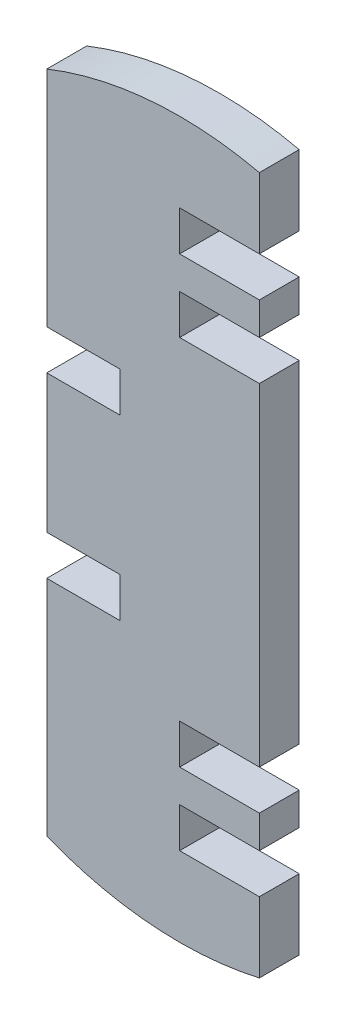
ISO-10303-21;
HEADER;
FILE_DESCRIPTION(('STEP AP214'),'2;1');
FILE_NAME('part.step','',(''),(''),'','','');
FILE_SCHEMA(('AUTOMOTIVE_DESIGN { 1 0 10303 214 1 1 1 1 }'));
ENDSEC;
DATA;
#1=APPLICATION_CONTEXT('core data for automotive mechanical design processes');
#2=APPLICATION_PROTOCOL_DEFINITION('international standard','automotive_design',2000,#1);
#3=PRODUCT_CONTEXT('',#1,'mechanical');
#4=PRODUCT('Part','Part','',(#3));
#5=PRODUCT_RELATED_PRODUCT_CATEGORY('part','',(#4));
#6=PRODUCT_DEFINITION_FORMATION('','',#4);
#7=PRODUCT_DEFINITION_CONTEXT('part definition',#1,'design');
#8=PRODUCT_DEFINITION('design','',#6,#7);
#9=PRODUCT_DEFINITION_SHAPE('','',#8);
#10=(LENGTH_UNIT() NAMED_UNIT(*) SI_UNIT(.MILLI.,.METRE.));
#11=(NAMED_UNIT(*) PLANE_ANGLE_UNIT() SI_UNIT($,.RADIAN.));
#12=(NAMED_UNIT(*) SI_UNIT($,.STERADIAN.) SOLID_ANGLE_UNIT());
#13=UNCERTAINTY_MEASURE_WITH_UNIT(LENGTH_MEASURE(1.E-05),#10,'distance_accuracy_value','');
#14=(GEOMETRIC_REPRESENTATION_CONTEXT(3) GLOBAL_UNCERTAINTY_ASSIGNED_CONTEXT((#13)) GLOBAL_UNIT_ASSIGNED_CONTEXT((#10,
#11,#12)) REPRESENTATION_CONTEXT('',''));
#15=CARTESIAN_POINT('',(0.,0.,0.));
#16=DIRECTION('',(0.,0.,1.));
#17=DIRECTION('',(1.,0.,0.));
#18=AXIS2_PLACEMENT_3D('',#15,#16,#17);
#19=CARTESIAN_POINT('',(683.467463005596,-95.0878027381918,3.));
#20=DIRECTION('',(0.,1.,0.));
#21=DIRECTION('',(0.,0.,1.));
#22=AXIS2_PLACEMENT_3D('',#19,#20,#21);
#23=PLANE('',#22);
#24=DIRECTION('',(1.,0.,0.));
#25=VECTOR('',#24,1.);
#26=CARTESIAN_POINT('',(683.467463005596,-95.0878027381918,0.));
#27=LINE('',#26,#25);
#28=CARTESIAN_POINT('',(677.938729313422,-95.0878027381918,0.));
#29=VERTEX_POINT('',#28);
#30=CARTESIAN_POINT('',(683.467463005596,-95.0878027381918,0.));
#31=VERTEX_POINT('',#30);
#32=EDGE_CURVE('E220',#29,#31,#27,.T.);
#33=ORIENTED_EDGE('',*,*,#32,.T.);
#34=DIRECTION('',(0.,0.,-1.));
#35=VECTOR('',#34,1.);
#36=CARTESIAN_POINT('',(683.467463005596,-95.0878027381918,3.));
#37=LINE('',#36,#35);
#38=CARTESIAN_POINT('',(683.467463005596,-95.0878027381918,3.));
#39=VERTEX_POINT('',#38);
#40=EDGE_CURVE('E11',#39,#31,#37,.T.);
#41=ORIENTED_EDGE('',*,*,#40,.F.);
#42=DIRECTION('',(1.,0.,0.));
#43=VECTOR('',#42,1.);
#44=CARTESIAN_POINT('',(683.467463005596,-95.0878027381918,3.));
#45=LINE('',#44,#43);
#46=CARTESIAN_POINT('',(677.938729313422,-95.0878027381918,3.));
#47=VERTEX_POINT('',#46);
#48=EDGE_CURVE('E287',#47,#39,#45,.T.);
#49=ORIENTED_EDGE('',*,*,#48,.F.);
#50=DIRECTION('',(0.,0.,-1.));
#51=VECTOR('',#50,1.);
#52=CARTESIAN_POINT('',(677.938729313422,-95.0878027381918,3.));
#53=LINE('',#52,#51);
#54=EDGE_CURVE('E233',#47,#29,#53,.T.);
#55=ORIENTED_EDGE('',*,*,#54,.T.);
#56=EDGE_LOOP('',(#33,#41,#49,#55));
#57=FACE_BOUND('',#56,.T.);
#58=ADVANCED_FACE('F32',(#57),#23,.F.);
#59=CARTESIAN_POINT('',(683.467463005596,-98.0878027381918,3.));
#60=DIRECTION('',(1.,0.,0.));
#61=DIRECTION('',(0.,0.,-1.));
#62=AXIS2_PLACEMENT_3D('',#59,#60,#61);
#63=PLANE('',#62);
#64=DIRECTION('',(0.,-1.,0.));
#65=VECTOR('',#64,1.);
#66=CARTESIAN_POINT('',(683.467463005596,-98.0878027381918,0.));
#67=LINE('',#66,#65);
#68=CARTESIAN_POINT('',(683.467463005596,-98.0878027381918,0.));
#69=VERTEX_POINT('',#68);
#70=EDGE_CURVE('E216',#31,#69,#67,.T.);
#71=ORIENTED_EDGE('',*,*,#70,.T.);
#72=DIRECTION('',(0.,0.,-1.));
#73=VECTOR('',#72,1.);
#74=CARTESIAN_POINT('',(683.467463005596,-98.0878027381918,3.));
#75=LINE('',#74,#73);
#76=CARTESIAN_POINT('',(683.467463005596,-98.0878027381918,3.));
#77=VERTEX_POINT('',#76);
#78=EDGE_CURVE('E39',#77,#69,#75,.T.);
#79=ORIENTED_EDGE('',*,*,#78,.F.);
#80=DIRECTION('',(0.,-1.,0.));
#81=VECTOR('',#80,1.);
#82=CARTESIAN_POINT('',(683.467463005596,-98.0878027381918,3.));
#83=LINE('',#82,#81);
#84=EDGE_CURVE('E229',#39,#77,#83,.T.);
#85=ORIENTED_EDGE('',*,*,#84,.F.);
#86=ORIENTED_EDGE('',*,*,#40,.T.);
#87=EDGE_LOOP('',(#71,#79,#85,#86));
#88=FACE_BOUND('',#87,.T.);
#89=ADVANCED_FACE('F228',(#88),#63,.F.);
#90=CARTESIAN_POINT('',(677.938729313422,-98.0878027381918,3.));
#91=DIRECTION('',(0.,-1.,0.));
#92=DIRECTION('',(0.,0.,-1.));
#93=AXIS2_PLACEMENT_3D('',#90,#91,#92);
#94=PLANE('',#93);
#95=DIRECTION('',(-1.,0.,0.));
#96=VECTOR('',#95,1.);
#97=CARTESIAN_POINT('',(677.938729313422,-98.0878027381918,0.));
#98=LINE('',#97,#96);
#99=CARTESIAN_POINT('',(677.938729313422,-98.0878027381918,0.));
#100=VERTEX_POINT('',#99);
#101=EDGE_CURVE('E222',#69,#100,#98,.T.);
#102=ORIENTED_EDGE('',*,*,#101,.T.);
#103=DIRECTION('',(0.,0.,-1.));
#104=VECTOR('',#103,1.);
#105=CARTESIAN_POINT('',(677.938729313422,-98.0878027381918,3.));
#106=LINE('',#105,#104);
#107=CARTESIAN_POINT('',(677.938729313422,-98.0878027381918,3.));
#108=VERTEX_POINT('',#107);
#109=EDGE_CURVE('E413',#108,#100,#106,.T.);
#110=ORIENTED_EDGE('',*,*,#109,.F.);
#111=DIRECTION('',(-1.,0.,0.));
#112=VECTOR('',#111,1.);
#113=CARTESIAN_POINT('',(677.938729313422,-98.0878027381918,3.));
#114=LINE('',#113,#112);
#115=EDGE_CURVE('E290',#77,#108,#114,.T.);
#116=ORIENTED_EDGE('',*,*,#115,.F.);
#117=ORIENTED_EDGE('',*,*,#78,.T.);
#118=EDGE_LOOP('',(#102,#110,#116,#117));
#119=FACE_BOUND('',#118,.T.);
#120=ADVANCED_FACE('F417',(#119),#94,.F.);
#121=CARTESIAN_POINT('',(677.938729313422,-98.0878027381918,3.));
#122=DIRECTION('',(1.,0.,0.));
#123=DIRECTION('',(0.,0.,-1.));
#124=AXIS2_PLACEMENT_3D('',#121,#122,#123);
#125=PLANE('',#124);
#126=DIRECTION('',(0.,-1.,0.));
#127=VECTOR('',#126,1.);
#128=CARTESIAN_POINT('',(677.938729313422,-98.0878027381918,0.));
#129=LINE('',#128,#127);
#130=CARTESIAN_POINT('',(677.938729313422,-108.479521793119,0.));
#131=VERTEX_POINT('',#130);
#132=EDGE_CURVE('E237',#100,#131,#129,.T.);
#133=ORIENTED_EDGE('',*,*,#132,.T.);
#134=DIRECTION('',(0.,0.,-1.));
#135=VECTOR('',#134,1.);
#136=CARTESIAN_POINT('',(677.938729313422,-108.479521793119,3.));
#137=LINE('',#136,#135);
#138=CARTESIAN_POINT('',(677.938729313422,-108.479521793119,3.));
#139=VERTEX_POINT('',#138);
#140=EDGE_CURVE('E410',#139,#131,#137,.T.);
#141=ORIENTED_EDGE('',*,*,#140,.F.);
#142=DIRECTION('',(0.,-1.,0.));
#143=VECTOR('',#142,1.);
#144=CARTESIAN_POINT('',(677.938729313422,-98.0878027381918,3.));
#145=LINE('',#144,#143);
#146=EDGE_CURVE('E292',#108,#139,#145,.T.);
#147=ORIENTED_EDGE('',*,*,#146,.F.);
#148=ORIENTED_EDGE('',*,*,#109,.T.);
#149=EDGE_LOOP('',(#133,#141,#147,#148));
#150=FACE_BOUND('',#149,.T.);
#151=ADVANCED_FACE('F425',(#150),#125,.F.);
#152=CARTESIAN_POINT('',(677.938729313422,-108.479521793119,3.));
#153=DIRECTION('',(0.,1.,0.));
#154=DIRECTION('',(0.,0.,1.));
#155=AXIS2_PLACEMENT_3D('',#152,#153,#154);
#156=PLANE('',#155);
#157=DIRECTION('',(1.,0.,0.));
#158=VECTOR('',#157,1.);
#159=CARTESIAN_POINT('',(677.938729313422,-108.479521793119,0.));
#160=LINE('',#159,#158);
#161=CARTESIAN_POINT('',(683.467463005596,-108.479521793119,0.));
#162=VERTEX_POINT('',#161);
#163=EDGE_CURVE('E239',#131,#162,#160,.T.);
#164=ORIENTED_EDGE('',*,*,#163,.T.);
#165=DIRECTION('',(0.,0.,-1.));
#166=VECTOR('',#165,1.);
#167=CARTESIAN_POINT('',(683.467463005596,-108.479521793119,3.));
#168=LINE('',#167,#166);
#169=CARTESIAN_POINT('',(683.467463005596,-108.479521793119,3.));
#170=VERTEX_POINT('',#169);
#171=EDGE_CURVE('E407',#170,#162,#168,.T.);
#172=ORIENTED_EDGE('',*,*,#171,.F.);
#173=DIRECTION('',(1.,0.,0.));
#174=VECTOR('',#173,1.);
#175=CARTESIAN_POINT('',(677.938729313422,-108.479521793119,3.));
#176=LINE('',#175,#174);
#177=EDGE_CURVE('E294',#139,#170,#176,.T.);
#178=ORIENTED_EDGE('',*,*,#177,.F.);
#179=ORIENTED_EDGE('',*,*,#140,.T.);
#180=EDGE_LOOP('',(#164,#172,#178,#179));
#181=FACE_BOUND('',#180,.T.);
#182=ADVANCED_FACE('F428',(#181),#156,.F.);
#183=CARTESIAN_POINT('',(683.467463005596,-108.479521793119,3.));
#184=DIRECTION('',(1.,0.,0.));
#185=DIRECTION('',(0.,0.,-1.));
#186=AXIS2_PLACEMENT_3D('',#183,#184,#185);
#187=PLANE('',#186);
#188=DIRECTION('',(0.,-1.,0.));
#189=VECTOR('',#188,1.);
#190=CARTESIAN_POINT('',(683.467463005596,-108.479521793119,0.));
#191=LINE('',#190,#189);
#192=CARTESIAN_POINT('',(683.467463005596,-111.479521793119,0.));
#193=VERTEX_POINT('',#192);
#194=EDGE_CURVE('E241',#162,#193,#191,.T.);
#195=ORIENTED_EDGE('',*,*,#194,.T.);
#196=DIRECTION('',(0.,0.,-1.));
#197=VECTOR('',#196,1.);
#198=CARTESIAN_POINT('',(683.467463005596,-111.479521793119,3.));
#199=LINE('',#198,#197);
#200=CARTESIAN_POINT('',(683.467463005596,-111.479521793119,3.));
#201=VERTEX_POINT('',#200);
#202=EDGE_CURVE('E404',#201,#193,#199,.T.);
#203=ORIENTED_EDGE('',*,*,#202,.F.);
#204=DIRECTION('',(0.,-1.,0.));
#205=VECTOR('',#204,1.);
#206=CARTESIAN_POINT('',(683.467463005596,-108.479521793119,3.));
#207=LINE('',#206,#205);
#208=EDGE_CURVE('E296',#170,#201,#207,.T.);
#209=ORIENTED_EDGE('',*,*,#208,.F.);
#210=ORIENTED_EDGE('',*,*,#171,.T.);
#211=EDGE_LOOP('',(#195,#203,#209,#210));
#212=FACE_BOUND('',#211,.T.);
#213=ADVANCED_FACE('F433',(#212),#187,.F.);
#214=CARTESIAN_POINT('',(683.467463005596,-111.479521793119,3.));
#215=DIRECTION('',(0.,-1.,0.));
#216=DIRECTION('',(0.,0.,-1.));
#217=AXIS2_PLACEMENT_3D('',#214,#215,#216);
#218=PLANE('',#217);
#219=DIRECTION('',(-1.,0.,0.));
#220=VECTOR('',#219,1.);
#221=CARTESIAN_POINT('',(683.467463005596,-111.479521793119,0.));
#222=LINE('',#221,#220);
#223=CARTESIAN_POINT('',(677.938729313422,-111.479521793119,0.));
#224=VERTEX_POINT('',#223);
#225=EDGE_CURVE('E243',#193,#224,#222,.T.);
#226=ORIENTED_EDGE('',*,*,#225,.T.);
#227=DIRECTION('',(0.,0.,-1.));
#228=VECTOR('',#227,1.);
#229=CARTESIAN_POINT('',(677.938729313422,-111.479521793119,3.));
#230=LINE('',#229,#228);
#231=CARTESIAN_POINT('',(677.938729313422,-111.479521793119,3.));
#232=VERTEX_POINT('',#231);
#233=EDGE_CURVE('E401',#232,#224,#230,.T.);
#234=ORIENTED_EDGE('',*,*,#233,.F.);
#235=DIRECTION('',(-1.,0.,0.));
#236=VECTOR('',#235,1.);
#237=CARTESIAN_POINT('',(683.467463005596,-111.479521793119,3.));
#238=LINE('',#237,#236);
#239=EDGE_CURVE('E298',#201,#232,#238,.T.);
#240=ORIENTED_EDGE('',*,*,#239,.F.);
#241=ORIENTED_EDGE('',*,*,#202,.T.);
#242=EDGE_LOOP('',(#226,#234,#240,#241));
#243=FACE_BOUND('',#242,.T.);
#244=ADVANCED_FACE('F439',(#243),#218,.F.);
#245=CARTESIAN_POINT('',(677.938729313422,-128.283662265656,3.));
#246=DIRECTION('',(1.,0.,0.));
#247=DIRECTION('',(0.,0.,-1.));
#248=AXIS2_PLACEMENT_3D('',#245,#246,#247);
#249=PLANE('',#248);
#250=DIRECTION('',(0.,-1.,0.));
#251=VECTOR('',#250,1.);
#252=CARTESIAN_POINT('',(677.938729313422,-128.283662265656,0.));
#253=LINE('',#252,#251);
#254=CARTESIAN_POINT('',(677.938729313422,-128.283662265656,0.));
#255=VERTEX_POINT('',#254);
#256=EDGE_CURVE('E245',#224,#255,#253,.T.);
#257=ORIENTED_EDGE('',*,*,#256,.T.);
#258=DIRECTION('',(0.,0.,-1.));
#259=VECTOR('',#258,1.);
#260=CARTESIAN_POINT('',(677.938729313422,-128.283662265656,3.));
#261=LINE('',#260,#259);
#262=CARTESIAN_POINT('',(677.938729313422,-128.283662265656,3.));
#263=VERTEX_POINT('',#262);
#264=EDGE_CURVE('E398',#263,#255,#261,.T.);
#265=ORIENTED_EDGE('',*,*,#264,.F.);
#266=DIRECTION('',(0.,-1.,0.));
#267=VECTOR('',#266,1.);
#268=CARTESIAN_POINT('',(677.938729313422,-128.283662265656,3.));
#269=LINE('',#268,#267);
#270=EDGE_CURVE('E300',#232,#263,#269,.T.);
#271=ORIENTED_EDGE('',*,*,#270,.F.);
#272=ORIENTED_EDGE('',*,*,#233,.T.);
#273=EDGE_LOOP('',(#257,#265,#271,#272));
#274=FACE_BOUND('',#273,.T.);
#275=ADVANCED_FACE('F443',(#274),#249,.F.);
#276=CARTESIAN_POINT('',(687.938729313422,-103.283662265656,3.));
#277=DIRECTION('',(0.,0.,-1.));
#278=DIRECTION('',(-1.,0.,0.));
#279=AXIS2_PLACEMENT_3D('',#276,#277,#278);
#280=CYLINDRICAL_SURFACE('',#279,26.9258240356725);
#281=CARTESIAN_POINT('',(687.938729313422,-103.283662265656,0.));
#282=DIRECTION('',(0.,0.,1.));
#283=DIRECTION('',(1.,0.,0.));
#284=AXIS2_PLACEMENT_3D('',#281,#282,#283);
#285=CIRCLE('',#284,26.9258240356725);
#286=CARTESIAN_POINT('',(693.938729313422,-129.532471762469,0.));
#287=VERTEX_POINT('',#286);
#288=EDGE_CURVE('E247',#255,#287,#285,.T.);
#289=ORIENTED_EDGE('',*,*,#288,.T.);
#290=DIRECTION('',(0.,0.,-1.));
#291=VECTOR('',#290,1.);
#292=CARTESIAN_POINT('',(693.938729313422,-129.532471762469,3.));
#293=LINE('',#292,#291);
#294=CARTESIAN_POINT('',(693.938729313422,-129.532471762469,3.));
#295=VERTEX_POINT('',#294);
#296=EDGE_CURVE('E395',#295,#287,#293,.T.);
#297=ORIENTED_EDGE('',*,*,#296,.F.);
#298=CARTESIAN_POINT('',(687.938729313422,-103.283662265656,3.));
#299=DIRECTION('',(0.,0.,1.));
#300=DIRECTION('',(1.,0.,0.));
#301=AXIS2_PLACEMENT_3D('',#298,#299,#300);
#302=CIRCLE('',#301,26.9258240356725);
#303=EDGE_CURVE('E302',#263,#295,#302,.T.);
#304=ORIENTED_EDGE('',*,*,#303,.F.);
#305=ORIENTED_EDGE('',*,*,#264,.T.);
#306=EDGE_LOOP('',(#289,#297,#304,#305));
#307=FACE_BOUND('',#306,.T.);
#308=ADVANCED_FACE('F448',(#307),#280,.T.);
#309=CARTESIAN_POINT('',(693.938729313422,-124.233634180954,3.));
#310=DIRECTION('',(-1.,0.,0.));
#311=DIRECTION('',(0.,0.,1.));
#312=AXIS2_PLACEMENT_3D('',#309,#310,#311);
#313=PLANE('',#312);
#314=DIRECTION('',(0.,1.,0.));
#315=VECTOR('',#314,1.);
#316=CARTESIAN_POINT('',(693.938729313422,-124.233634180954,0.));
#317=LINE('',#316,#315);
#318=CARTESIAN_POINT('',(693.938729313422,-124.233634180954,0.));
#319=VERTEX_POINT('',#318);
#320=EDGE_CURVE('E249',#287,#319,#317,.T.);
#321=ORIENTED_EDGE('',*,*,#320,.T.);
#322=DIRECTION('',(0.,0.,-1.));
#323=VECTOR('',#322,1.);
#324=CARTESIAN_POINT('',(693.938729313422,-124.233634180954,3.));
#325=LINE('',#324,#323);
#326=CARTESIAN_POINT('',(693.938729313422,-124.233634180954,3.));
#327=VERTEX_POINT('',#326);
#328=EDGE_CURVE('E392',#327,#319,#325,.T.);
#329=ORIENTED_EDGE('',*,*,#328,.F.);
#330=DIRECTION('',(0.,1.,0.));
#331=VECTOR('',#330,1.);
#332=CARTESIAN_POINT('',(693.938729313422,-124.233634180954,3.));
#333=LINE('',#332,#331);
#334=EDGE_CURVE('E304',#295,#327,#333,.T.);
#335=ORIENTED_EDGE('',*,*,#334,.F.);
#336=ORIENTED_EDGE('',*,*,#296,.T.);
#337=EDGE_LOOP('',(#321,#329,#335,#336));
#338=FACE_BOUND('',#337,.T.);
#339=ADVANCED_FACE('F454',(#338),#313,.F.);
#340=CARTESIAN_POINT('',(687.938729313422,-124.233634180954,3.));
#341=DIRECTION('',(0.,-1.,0.));
#342=DIRECTION('',(0.,0.,-1.));
#343=AXIS2_PLACEMENT_3D('',#340,#341,#342);
#344=PLANE('',#343);
#345=DIRECTION('',(-1.,0.,0.));
#346=VECTOR('',#345,1.);
#347=CARTESIAN_POINT('',(687.938729313422,-124.233634180954,0.));
#348=LINE('',#347,#346);
#349=CARTESIAN_POINT('',(687.938729313422,-124.233634180954,0.));
#350=VERTEX_POINT('',#349);
#351=EDGE_CURVE('E251',#319,#350,#348,.T.);
#352=ORIENTED_EDGE('',*,*,#351,.T.);
#353=DIRECTION('',(0.,0.,-1.));
#354=VECTOR('',#353,1.);
#355=CARTESIAN_POINT('',(687.938729313422,-124.233634180954,3.));
#356=LINE('',#355,#354);
#357=CARTESIAN_POINT('',(687.938729313422,-124.233634180954,3.));
#358=VERTEX_POINT('',#357);
#359=EDGE_CURVE('E389',#358,#350,#356,.T.);
#360=ORIENTED_EDGE('',*,*,#359,.F.);
#361=DIRECTION('',(-1.,0.,0.));
#362=VECTOR('',#361,1.);
#363=CARTESIAN_POINT('',(687.938729313422,-124.233634180954,3.));
#364=LINE('',#363,#362);
#365=EDGE_CURVE('E306',#327,#358,#364,.T.);
#366=ORIENTED_EDGE('',*,*,#365,.F.);
#367=ORIENTED_EDGE('',*,*,#328,.T.);
#368=EDGE_LOOP('',(#352,#360,#366,#367));
#369=FACE_BOUND('',#368,.T.);
#370=ADVANCED_FACE('F458',(#369),#344,.F.);
#371=CARTESIAN_POINT('',(687.938729313422,-121.233634180954,3.));
#372=DIRECTION('',(-1.,0.,0.));
#373=DIRECTION('',(0.,0.,1.));
#374=AXIS2_PLACEMENT_3D('',#371,#372,#373);
#375=PLANE('',#374);
#376=DIRECTION('',(0.,1.,0.));
#377=VECTOR('',#376,1.);
#378=CARTESIAN_POINT('',(687.938729313422,-121.233634180954,0.));
#379=LINE('',#378,#377);
#380=CARTESIAN_POINT('',(687.938729313422,-121.233634180954,0.));
#381=VERTEX_POINT('',#380);
#382=EDGE_CURVE('E253',#350,#381,#379,.T.);
#383=ORIENTED_EDGE('',*,*,#382,.T.);
#384=DIRECTION('',(0.,0.,-1.));
#385=VECTOR('',#384,1.);
#386=CARTESIAN_POINT('',(687.938729313422,-121.233634180954,3.));
#387=LINE('',#386,#385);
#388=CARTESIAN_POINT('',(687.938729313422,-121.233634180954,3.));
#389=VERTEX_POINT('',#388);
#390=EDGE_CURVE('E386',#389,#381,#387,.T.);
#391=ORIENTED_EDGE('',*,*,#390,.F.);
#392=DIRECTION('',(0.,1.,0.));
#393=VECTOR('',#392,1.);
#394=CARTESIAN_POINT('',(687.938729313422,-121.233634180954,3.));
#395=LINE('',#394,#393);
#396=EDGE_CURVE('E308',#358,#389,#395,.T.);
#397=ORIENTED_EDGE('',*,*,#396,.F.);
#398=ORIENTED_EDGE('',*,*,#359,.T.);
#399=EDGE_LOOP('',(#383,#391,#397,#398));
#400=FACE_BOUND('',#399,.T.);
#401=ADVANCED_FACE('F463',(#400),#375,.F.);
#402=CARTESIAN_POINT('',(687.938729313422,-121.233634180954,3.));
#403=DIRECTION('',(0.,1.,0.));
#404=DIRECTION('',(0.,0.,1.));
#405=AXIS2_PLACEMENT_3D('',#402,#403,#404);
#406=PLANE('',#405);
#407=DIRECTION('',(1.,0.,0.));
#408=VECTOR('',#407,1.);
#409=CARTESIAN_POINT('',(687.938729313422,-121.233634180954,0.));
#410=LINE('',#409,#408);
#411=CARTESIAN_POINT('',(693.938729313422,-121.233634180954,0.));
#412=VERTEX_POINT('',#411);
#413=EDGE_CURVE('E255',#381,#412,#410,.T.);
#414=ORIENTED_EDGE('',*,*,#413,.T.);
#415=DIRECTION('',(0.,0.,-1.));
#416=VECTOR('',#415,1.);
#417=CARTESIAN_POINT('',(693.938729313422,-121.233634180954,3.));
#418=LINE('',#417,#416);
#419=CARTESIAN_POINT('',(693.938729313422,-121.233634180954,3.));
#420=VERTEX_POINT('',#419);
#421=EDGE_CURVE('E383',#420,#412,#418,.T.);
#422=ORIENTED_EDGE('',*,*,#421,.F.);
#423=DIRECTION('',(1.,0.,0.));
#424=VECTOR('',#423,1.);
#425=CARTESIAN_POINT('',(687.938729313422,-121.233634180954,3.));
#426=LINE('',#425,#424);
#427=EDGE_CURVE('E310',#389,#420,#426,.T.);
#428=ORIENTED_EDGE('',*,*,#427,.F.);
#429=ORIENTED_EDGE('',*,*,#390,.T.);
#430=EDGE_LOOP('',(#414,#422,#428,#429));
#431=FACE_BOUND('',#430,.T.);
#432=ADVANCED_FACE('F469',(#431),#406,.F.);
#433=CARTESIAN_POINT('',(693.938729313422,-118.783662265656,3.));
#434=DIRECTION('',(-1.,0.,0.));
#435=DIRECTION('',(0.,0.,1.));
#436=AXIS2_PLACEMENT_3D('',#433,#434,#435);
#437=PLANE('',#436);
#438=DIRECTION('',(0.,1.,0.));
#439=VECTOR('',#438,1.);
#440=CARTESIAN_POINT('',(693.938729313422,-118.783662265656,0.));
#441=LINE('',#440,#439);
#442=CARTESIAN_POINT('',(693.938729313422,-118.783662265656,0.));
#443=VERTEX_POINT('',#442);
#444=EDGE_CURVE('E257',#412,#443,#441,.T.);
#445=ORIENTED_EDGE('',*,*,#444,.T.);
#446=DIRECTION('',(0.,0.,-1.));
#447=VECTOR('',#446,1.);
#448=CARTESIAN_POINT('',(693.938729313422,-118.783662265656,3.));
#449=LINE('',#448,#447);
#450=CARTESIAN_POINT('',(693.938729313422,-118.783662265656,3.));
#451=VERTEX_POINT('',#450);
#452=EDGE_CURVE('E380',#451,#443,#449,.T.);
#453=ORIENTED_EDGE('',*,*,#452,.F.);
#454=DIRECTION('',(0.,1.,0.));
#455=VECTOR('',#454,1.);
#456=CARTESIAN_POINT('',(693.938729313422,-118.783662265656,3.));
#457=LINE('',#456,#455);
#458=EDGE_CURVE('E312',#420,#451,#457,.T.);
#459=ORIENTED_EDGE('',*,*,#458,.F.);
#460=ORIENTED_EDGE('',*,*,#421,.T.);
#461=EDGE_LOOP('',(#445,#453,#459,#460));
#462=FACE_BOUND('',#461,.T.);
#463=ADVANCED_FACE('F473',(#462),#437,.F.);
#464=CARTESIAN_POINT('',(687.938729313422,-118.783662265656,3.));
#465=DIRECTION('',(0.,-1.,0.));
#466=DIRECTION('',(0.,0.,-1.));
#467=AXIS2_PLACEMENT_3D('',#464,#465,#466);
#468=PLANE('',#467);
#469=DIRECTION('',(-1.,0.,0.));
#470=VECTOR('',#469,1.);
#471=CARTESIAN_POINT('',(687.938729313422,-118.783662265656,0.));
#472=LINE('',#471,#470);
#473=CARTESIAN_POINT('',(687.938729313422,-118.783662265656,0.));
#474=VERTEX_POINT('',#473);
#475=EDGE_CURVE('E259',#443,#474,#472,.T.);
#476=ORIENTED_EDGE('',*,*,#475,.T.);
#477=DIRECTION('',(0.,0.,-1.));
#478=VECTOR('',#477,1.);
#479=CARTESIAN_POINT('',(687.938729313422,-118.783662265656,3.));
#480=LINE('',#479,#478);
#481=CARTESIAN_POINT('',(687.938729313422,-118.783662265656,3.));
#482=VERTEX_POINT('',#481);
#483=EDGE_CURVE('E377',#482,#474,#480,.T.);
#484=ORIENTED_EDGE('',*,*,#483,.F.);
#485=DIRECTION('',(-1.,0.,0.));
#486=VECTOR('',#485,1.);
#487=CARTESIAN_POINT('',(687.938729313422,-118.783662265656,3.));
#488=LINE('',#487,#486);
#489=EDGE_CURVE('E314',#451,#482,#488,.T.);
#490=ORIENTED_EDGE('',*,*,#489,.F.);
#491=ORIENTED_EDGE('',*,*,#452,.T.);
#492=EDGE_LOOP('',(#476,#484,#490,#491));
#493=FACE_BOUND('',#492,.T.);
#494=ADVANCED_FACE('F478',(#493),#468,.F.);
#495=CARTESIAN_POINT('',(687.938729313422,-118.783662265656,3.));
#496=DIRECTION('',(-1.,0.,0.));
#497=DIRECTION('',(0.,0.,1.));
#498=AXIS2_PLACEMENT_3D('',#495,#496,#497);
#499=PLANE('',#498);
#500=DIRECTION('',(0.,1.,0.));
#501=VECTOR('',#500,1.);
#502=CARTESIAN_POINT('',(687.938729313422,-118.783662265656,0.));
#503=LINE('',#502,#501);
#504=CARTESIAN_POINT('',(687.938729313422,-115.783662265656,0.));
#505=VERTEX_POINT('',#504);
#506=EDGE_CURVE('E261',#474,#505,#503,.T.);
#507=ORIENTED_EDGE('',*,*,#506,.T.);
#508=DIRECTION('',(0.,0.,-1.));
#509=VECTOR('',#508,1.);
#510=CARTESIAN_POINT('',(687.938729313422,-115.783662265656,3.));
#511=LINE('',#510,#509);
#512=CARTESIAN_POINT('',(687.938729313422,-115.783662265656,3.));
#513=VERTEX_POINT('',#512);
#514=EDGE_CURVE('E374',#513,#505,#511,.T.);
#515=ORIENTED_EDGE('',*,*,#514,.F.);
#516=DIRECTION('',(0.,1.,0.));
#517=VECTOR('',#516,1.);
#518=CARTESIAN_POINT('',(687.938729313422,-118.783662265656,3.));
#519=LINE('',#518,#517);
#520=EDGE_CURVE('E316',#482,#513,#519,.T.);
#521=ORIENTED_EDGE('',*,*,#520,.F.);
#522=ORIENTED_EDGE('',*,*,#483,.T.);
#523=EDGE_LOOP('',(#507,#515,#521,#522));
#524=FACE_BOUND('',#523,.T.);
#525=ADVANCED_FACE('F484',(#524),#499,.F.);
#526=CARTESIAN_POINT('',(687.938729313422,-115.783662265656,3.));
#527=DIRECTION('',(0.,1.,0.));
#528=DIRECTION('',(0.,0.,1.));
#529=AXIS2_PLACEMENT_3D('',#526,#527,#528);
#530=PLANE('',#529);
#531=DIRECTION('',(1.,0.,0.));
#532=VECTOR('',#531,1.);
#533=CARTESIAN_POINT('',(687.938729313422,-115.783662265656,0.));
#534=LINE('',#533,#532);
#535=CARTESIAN_POINT('',(693.938729313422,-115.783662265656,0.));
#536=VERTEX_POINT('',#535);
#537=EDGE_CURVE('E263',#505,#536,#534,.T.);
#538=ORIENTED_EDGE('',*,*,#537,.T.);
#539=DIRECTION('',(0.,0.,-1.));
#540=VECTOR('',#539,1.);
#541=CARTESIAN_POINT('',(693.938729313422,-115.783662265656,3.));
#542=LINE('',#541,#540);
#543=CARTESIAN_POINT('',(693.938729313422,-115.783662265656,3.));
#544=VERTEX_POINT('',#543);
#545=EDGE_CURVE('E371',#544,#536,#542,.T.);
#546=ORIENTED_EDGE('',*,*,#545,.F.);
#547=DIRECTION('',(1.,0.,0.));
#548=VECTOR('',#547,1.);
#549=CARTESIAN_POINT('',(687.938729313422,-115.783662265656,3.));
#550=LINE('',#549,#548);
#551=EDGE_CURVE('E318',#513,#544,#550,.T.);
#552=ORIENTED_EDGE('',*,*,#551,.F.);
#553=ORIENTED_EDGE('',*,*,#514,.T.);
#554=EDGE_LOOP('',(#538,#546,#552,#553));
#555=FACE_BOUND('',#554,.T.);
#556=ADVANCED_FACE('F488',(#555),#530,.F.);
#557=CARTESIAN_POINT('',(693.938729313422,-90.7836622656556,3.));
#558=DIRECTION('',(-1.,0.,0.));
#559=DIRECTION('',(0.,0.,1.));
#560=AXIS2_PLACEMENT_3D('',#557,#558,#559);
#561=PLANE('',#560);
#562=DIRECTION('',(0.,1.,0.));
#563=VECTOR('',#562,1.);
#564=CARTESIAN_POINT('',(693.938729313422,-90.7836622656556,0.));
#565=LINE('',#564,#563);
#566=CARTESIAN_POINT('',(693.938729313422,-90.7836622656556,0.));
#567=VERTEX_POINT('',#566);
#568=EDGE_CURVE('E265',#536,#567,#565,.T.);
#569=ORIENTED_EDGE('',*,*,#568,.T.);
#570=DIRECTION('',(0.,0.,-1.));
#571=VECTOR('',#570,1.);
#572=CARTESIAN_POINT('',(693.938729313422,-90.7836622656556,3.));
#573=LINE('',#572,#571);
#574=CARTESIAN_POINT('',(693.938729313422,-90.7836622656556,3.));
#575=VERTEX_POINT('',#574);
#576=EDGE_CURVE('E368',#575,#567,#573,.T.);
#577=ORIENTED_EDGE('',*,*,#576,.F.);
#578=DIRECTION('',(0.,1.,0.));
#579=VECTOR('',#578,1.);
#580=CARTESIAN_POINT('',(693.938729313422,-90.7836622656556,3.));
#581=LINE('',#580,#579);
#582=EDGE_CURVE('E320',#544,#575,#581,.T.);
#583=ORIENTED_EDGE('',*,*,#582,.F.);
#584=ORIENTED_EDGE('',*,*,#545,.T.);
#585=EDGE_LOOP('',(#569,#577,#583,#584));
#586=FACE_BOUND('',#585,.T.);
#587=ADVANCED_FACE('F493',(#586),#561,.F.);
#588=CARTESIAN_POINT('',(687.938729313422,-90.7836622656556,3.));
#589=DIRECTION('',(0.,-1.,0.));
#590=DIRECTION('',(0.,0.,-1.));
#591=AXIS2_PLACEMENT_3D('',#588,#589,#590);
#592=PLANE('',#591);
#593=DIRECTION('',(-1.,0.,0.));
#594=VECTOR('',#593,1.);
#595=CARTESIAN_POINT('',(687.938729313422,-90.7836622656556,0.));
#596=LINE('',#595,#594);
#597=CARTESIAN_POINT('',(687.938729313422,-90.7836622656556,0.));
#598=VERTEX_POINT('',#597);
#599=EDGE_CURVE('E267',#567,#598,#596,.T.);
#600=ORIENTED_EDGE('',*,*,#599,.T.);
#601=DIRECTION('',(0.,0.,-1.));
#602=VECTOR('',#601,1.);
#603=CARTESIAN_POINT('',(687.938729313422,-90.7836622656556,3.));
#604=LINE('',#603,#602);
#605=CARTESIAN_POINT('',(687.938729313422,-90.7836622656556,3.));
#606=VERTEX_POINT('',#605);
#607=EDGE_CURVE('E365',#606,#598,#604,.T.);
#608=ORIENTED_EDGE('',*,*,#607,.F.);
#609=DIRECTION('',(-1.,0.,0.));
#610=VECTOR('',#609,1.);
#611=CARTESIAN_POINT('',(687.938729313422,-90.7836622656556,3.));
#612=LINE('',#611,#610);
#613=EDGE_CURVE('E322',#575,#606,#612,.T.);
#614=ORIENTED_EDGE('',*,*,#613,.F.);
#615=ORIENTED_EDGE('',*,*,#576,.T.);
#616=EDGE_LOOP('',(#600,#608,#614,#615));
#617=FACE_BOUND('',#616,.T.);
#618=ADVANCED_FACE('F499',(#617),#592,.F.);
#619=CARTESIAN_POINT('',(687.938729313422,-87.7836622656556,3.));
#620=DIRECTION('',(-1.,0.,0.));
#621=DIRECTION('',(0.,0.,1.));
#622=AXIS2_PLACEMENT_3D('',#619,#620,#621);
#623=PLANE('',#622);
#624=DIRECTION('',(0.,1.,0.));
#625=VECTOR('',#624,1.);
#626=CARTESIAN_POINT('',(687.938729313422,-87.7836622656556,0.));
#627=LINE('',#626,#625);
#628=CARTESIAN_POINT('',(687.938729313422,-87.7836622656556,0.));
#629=VERTEX_POINT('',#628);
#630=EDGE_CURVE('E269',#598,#629,#627,.T.);
#631=ORIENTED_EDGE('',*,*,#630,.T.);
#632=DIRECTION('',(0.,0.,-1.));
#633=VECTOR('',#632,1.);
#634=CARTESIAN_POINT('',(687.938729313422,-87.7836622656556,3.));
#635=LINE('',#634,#633);
#636=CARTESIAN_POINT('',(687.938729313422,-87.7836622656556,3.));
#637=VERTEX_POINT('',#636);
#638=EDGE_CURVE('E362',#637,#629,#635,.T.);
#639=ORIENTED_EDGE('',*,*,#638,.F.);
#640=DIRECTION('',(0.,1.,0.));
#641=VECTOR('',#640,1.);
#642=CARTESIAN_POINT('',(687.938729313422,-87.7836622656556,3.));
#643=LINE('',#642,#641);
#644=EDGE_CURVE('E324',#606,#637,#643,.T.);
#645=ORIENTED_EDGE('',*,*,#644,.F.);
#646=ORIENTED_EDGE('',*,*,#607,.T.);
#647=EDGE_LOOP('',(#631,#639,#645,#646));
#648=FACE_BOUND('',#647,.T.);
#649=ADVANCED_FACE('F503',(#648),#623,.F.);
#650=CARTESIAN_POINT('',(687.938729313422,-87.7836622656556,3.));
#651=DIRECTION('',(0.,1.,0.));
#652=DIRECTION('',(0.,0.,1.));
#653=AXIS2_PLACEMENT_3D('',#650,#651,#652);
#654=PLANE('',#653);
#655=DIRECTION('',(1.,0.,0.));
#656=VECTOR('',#655,1.);
#657=CARTESIAN_POINT('',(687.938729313422,-87.7836622656556,0.));
#658=LINE('',#657,#656);
#659=CARTESIAN_POINT('',(693.938729313422,-87.7836622656556,0.));
#660=VERTEX_POINT('',#659);
#661=EDGE_CURVE('E271',#629,#660,#658,.T.);
#662=ORIENTED_EDGE('',*,*,#661,.T.);
#663=DIRECTION('',(0.,0.,-1.));
#664=VECTOR('',#663,1.);
#665=CARTESIAN_POINT('',(693.938729313422,-87.7836622656556,3.));
#666=LINE('',#665,#664);
#667=CARTESIAN_POINT('',(693.938729313422,-87.7836622656556,3.));
#668=VERTEX_POINT('',#667);
#669=EDGE_CURVE('E359',#668,#660,#666,.T.);
#670=ORIENTED_EDGE('',*,*,#669,.F.);
#671=DIRECTION('',(1.,0.,0.));
#672=VECTOR('',#671,1.);
#673=CARTESIAN_POINT('',(687.938729313422,-87.7836622656556,3.));
#674=LINE('',#673,#672);
#675=EDGE_CURVE('E326',#637,#668,#674,.T.);
#676=ORIENTED_EDGE('',*,*,#675,.F.);
#677=ORIENTED_EDGE('',*,*,#638,.T.);
#678=EDGE_LOOP('',(#662,#670,#676,#677));
#679=FACE_BOUND('',#678,.T.);
#680=ADVANCED_FACE('F508',(#679),#654,.F.);
#681=CARTESIAN_POINT('',(693.938729313422,-87.7836622656556,3.));
#682=DIRECTION('',(-1.,0.,0.));
#683=DIRECTION('',(0.,0.,1.));
#684=AXIS2_PLACEMENT_3D('',#681,#682,#683);
#685=PLANE('',#684);
#686=DIRECTION('',(0.,1.,0.));
#687=VECTOR('',#686,1.);
#688=CARTESIAN_POINT('',(693.938729313422,-87.7836622656556,0.));
#689=LINE('',#688,#687);
#690=CARTESIAN_POINT('',(693.938729313422,-85.3336903503575,0.));
#691=VERTEX_POINT('',#690);
#692=EDGE_CURVE('E273',#660,#691,#689,.T.);
#693=ORIENTED_EDGE('',*,*,#692,.T.);
#694=DIRECTION('',(0.,0.,-1.));
#695=VECTOR('',#694,1.);
#696=CARTESIAN_POINT('',(693.938729313422,-85.3336903503575,3.));
#697=LINE('',#696,#695);
#698=CARTESIAN_POINT('',(693.938729313422,-85.3336903503575,3.));
#699=VERTEX_POINT('',#698);
#700=EDGE_CURVE('E356',#699,#691,#697,.T.);
#701=ORIENTED_EDGE('',*,*,#700,.F.);
#702=DIRECTION('',(0.,1.,0.));
#703=VECTOR('',#702,1.);
#704=CARTESIAN_POINT('',(693.938729313422,-87.7836622656556,3.));
#705=LINE('',#704,#703);
#706=EDGE_CURVE('E328',#668,#699,#705,.T.);
#707=ORIENTED_EDGE('',*,*,#706,.F.);
#708=ORIENTED_EDGE('',*,*,#669,.T.);
#709=EDGE_LOOP('',(#693,#701,#707,#708));
#710=FACE_BOUND('',#709,.T.);
#711=ADVANCED_FACE('F514',(#710),#685,.F.);
#712=CARTESIAN_POINT('',(687.938729313422,-85.3336903503575,3.));
#713=DIRECTION('',(0.,-1.,0.));
#714=DIRECTION('',(0.,0.,-1.));
#715=AXIS2_PLACEMENT_3D('',#712,#713,#714);
#716=PLANE('',#715);
#717=DIRECTION('',(-1.,0.,0.));
#718=VECTOR('',#717,1.);
#719=CARTESIAN_POINT('',(687.938729313422,-85.3336903503575,0.));
#720=LINE('',#719,#718);
#721=CARTESIAN_POINT('',(687.938729313422,-85.3336903503575,0.));
#722=VERTEX_POINT('',#721);
#723=EDGE_CURVE('E275',#691,#722,#720,.T.);
#724=ORIENTED_EDGE('',*,*,#723,.T.);
#725=DIRECTION('',(0.,0.,-1.));
#726=VECTOR('',#725,1.);
#727=CARTESIAN_POINT('',(687.938729313422,-85.3336903503575,3.));
#728=LINE('',#727,#726);
#729=CARTESIAN_POINT('',(687.938729313422,-85.3336903503575,3.));
#730=VERTEX_POINT('',#729);
#731=EDGE_CURVE('E353',#730,#722,#728,.T.);
#732=ORIENTED_EDGE('',*,*,#731,.F.);
#733=DIRECTION('',(-1.,0.,0.));
#734=VECTOR('',#733,1.);
#735=CARTESIAN_POINT('',(687.938729313422,-85.3336903503575,3.));
#736=LINE('',#735,#734);
#737=EDGE_CURVE('E330',#699,#730,#736,.T.);
#738=ORIENTED_EDGE('',*,*,#737,.F.);
#739=ORIENTED_EDGE('',*,*,#700,.T.);
#740=EDGE_LOOP('',(#724,#732,#738,#739));
#741=FACE_BOUND('',#740,.T.);
#742=ADVANCED_FACE('F518',(#741),#716,.F.);
#743=CARTESIAN_POINT('',(687.938729313422,-85.3336903503575,3.));
#744=DIRECTION('',(-1.,0.,0.));
#745=DIRECTION('',(0.,0.,1.));
#746=AXIS2_PLACEMENT_3D('',#743,#744,#745);
#747=PLANE('',#746);
#748=DIRECTION('',(0.,1.,0.));
#749=VECTOR('',#748,1.);
#750=CARTESIAN_POINT('',(687.938729313422,-85.3336903503575,0.));
#751=LINE('',#750,#749);
#752=CARTESIAN_POINT('',(687.938729313422,-82.3336903503575,0.));
#753=VERTEX_POINT('',#752);
#754=EDGE_CURVE('E277',#722,#753,#751,.T.);
#755=ORIENTED_EDGE('',*,*,#754,.T.);
#756=DIRECTION('',(0.,0.,-1.));
#757=VECTOR('',#756,1.);
#758=CARTESIAN_POINT('',(687.938729313422,-82.3336903503575,3.));
#759=LINE('',#758,#757);
#760=CARTESIAN_POINT('',(687.938729313422,-82.3336903503575,3.));
#761=VERTEX_POINT('',#760);
#762=EDGE_CURVE('E350',#761,#753,#759,.T.);
#763=ORIENTED_EDGE('',*,*,#762,.F.);
#764=DIRECTION('',(0.,1.,0.));
#765=VECTOR('',#764,1.);
#766=CARTESIAN_POINT('',(687.938729313422,-85.3336903503575,3.));
#767=LINE('',#766,#765);
#768=EDGE_CURVE('E332',#730,#761,#767,.T.);
#769=ORIENTED_EDGE('',*,*,#768,.F.);
#770=ORIENTED_EDGE('',*,*,#731,.T.);
#771=EDGE_LOOP('',(#755,#763,#769,#770));
#772=FACE_BOUND('',#771,.T.);
#773=ADVANCED_FACE('F523',(#772),#747,.F.);
#774=CARTESIAN_POINT('',(687.938729313422,-82.3336903503575,3.));
#775=DIRECTION('',(0.,1.,0.));
#776=DIRECTION('',(0.,0.,1.));
#777=AXIS2_PLACEMENT_3D('',#774,#775,#776);
#778=PLANE('',#777);
#779=DIRECTION('',(1.,0.,0.));
#780=VECTOR('',#779,1.);
#781=CARTESIAN_POINT('',(687.938729313422,-82.3336903503575,0.));
#782=LINE('',#781,#780);
#783=CARTESIAN_POINT('',(693.938729313422,-82.3336903503575,0.));
#784=VERTEX_POINT('',#783);
#785=EDGE_CURVE('E279',#753,#784,#782,.T.);
#786=ORIENTED_EDGE('',*,*,#785,.T.);
#787=DIRECTION('',(0.,0.,-1.));
#788=VECTOR('',#787,1.);
#789=CARTESIAN_POINT('',(693.938729313422,-82.3336903503575,3.));
#790=LINE('',#789,#788);
#791=CARTESIAN_POINT('',(693.938729313422,-82.3336903503575,3.));
#792=VERTEX_POINT('',#791);
#793=EDGE_CURVE('E347',#792,#784,#790,.T.);
#794=ORIENTED_EDGE('',*,*,#793,.F.);
#795=DIRECTION('',(1.,0.,0.));
#796=VECTOR('',#795,1.);
#797=CARTESIAN_POINT('',(687.938729313422,-82.3336903503575,3.));
#798=LINE('',#797,#796);
#799=EDGE_CURVE('E334',#761,#792,#798,.T.);
#800=ORIENTED_EDGE('',*,*,#799,.F.);
#801=ORIENTED_EDGE('',*,*,#762,.T.);
#802=EDGE_LOOP('',(#786,#794,#800,#801));
#803=FACE_BOUND('',#802,.T.);
#804=ADVANCED_FACE('F529',(#803),#778,.F.);
#805=CARTESIAN_POINT('',(693.938729313422,-82.3336903503575,3.));
#806=DIRECTION('',(-1.,0.,0.));
#807=DIRECTION('',(0.,0.,1.));
#808=AXIS2_PLACEMENT_3D('',#805,#806,#807);
#809=PLANE('',#808);
#810=DIRECTION('',(0.,1.,0.));
#811=VECTOR('',#810,1.);
#812=CARTESIAN_POINT('',(693.938729313422,-82.3336903503575,0.));
#813=LINE('',#812,#811);
#814=CARTESIAN_POINT('',(693.938729313422,-77.0348527688423,0.));
#815=VERTEX_POINT('',#814);
#816=EDGE_CURVE('E281',#784,#815,#813,.T.);
#817=ORIENTED_EDGE('',*,*,#816,.T.);
#818=DIRECTION('',(0.,0.,-1.));
#819=VECTOR('',#818,1.);
#820=CARTESIAN_POINT('',(693.938729313422,-77.0348527688423,3.));
#821=LINE('',#820,#819);
#822=CARTESIAN_POINT('',(693.938729313422,-77.0348527688423,3.));
#823=VERTEX_POINT('',#822);
#824=EDGE_CURVE('E344',#823,#815,#821,.T.);
#825=ORIENTED_EDGE('',*,*,#824,.F.);
#826=DIRECTION('',(0.,1.,0.));
#827=VECTOR('',#826,1.);
#828=CARTESIAN_POINT('',(693.938729313422,-82.3336903503575,3.));
#829=LINE('',#828,#827);
#830=EDGE_CURVE('E336',#792,#823,#829,.T.);
#831=ORIENTED_EDGE('',*,*,#830,.F.);
#832=ORIENTED_EDGE('',*,*,#793,.T.);
#833=EDGE_LOOP('',(#817,#825,#831,#832));
#834=FACE_BOUND('',#833,.T.);
#835=ADVANCED_FACE('F533',(#834),#809,.F.);
#836=CARTESIAN_POINT('',(687.938729313422,-103.283662265656,3.));
#837=DIRECTION('',(0.,0.,-1.));
#838=DIRECTION('',(-1.,0.,0.));
#839=AXIS2_PLACEMENT_3D('',#836,#837,#838);
#840=CYLINDRICAL_SURFACE('',#839,26.9258240356725);
#841=CARTESIAN_POINT('',(687.938729313422,-103.283662265656,0.));
#842=DIRECTION('',(0.,0.,1.));
#843=DIRECTION('',(-1.,0.,0.));
#844=AXIS2_PLACEMENT_3D('',#841,#842,#843);
#845=CIRCLE('',#844,26.9258240356725);
#846=CARTESIAN_POINT('',(677.938729313422,-78.2836622656556,0.));
#847=VERTEX_POINT('',#846);
#848=EDGE_CURVE('E283',#815,#847,#845,.T.);
#849=ORIENTED_EDGE('',*,*,#848,.T.);
#850=DIRECTION('',(0.,0.,-1.));
#851=VECTOR('',#850,1.);
#852=CARTESIAN_POINT('',(677.938729313422,-78.2836622656556,3.));
#853=LINE('',#852,#851);
#854=CARTESIAN_POINT('',(677.938729313422,-78.2836622656556,3.));
#855=VERTEX_POINT('',#854);
#856=EDGE_CURVE('E341',#855,#847,#853,.T.);
#857=ORIENTED_EDGE('',*,*,#856,.F.);
#858=CARTESIAN_POINT('',(687.938729313422,-103.283662265656,3.));
#859=DIRECTION('',(0.,0.,1.));
#860=DIRECTION('',(-1.,0.,0.));
#861=AXIS2_PLACEMENT_3D('',#858,#859,#860);
#862=CIRCLE('',#861,26.9258240356725);
#863=EDGE_CURVE('E51',#823,#855,#862,.T.);
#864=ORIENTED_EDGE('',*,*,#863,.F.);
#865=ORIENTED_EDGE('',*,*,#824,.T.);
#866=EDGE_LOOP('',(#849,#857,#864,#865));
#867=FACE_BOUND('',#866,.T.);
#868=ADVANCED_FACE('F536',(#867),#840,.T.);
#869=CARTESIAN_POINT('',(677.938729313422,-78.2836622656556,3.));
#870=DIRECTION('',(1.,0.,0.));
#871=DIRECTION('',(0.,0.,-1.));
#872=AXIS2_PLACEMENT_3D('',#869,#870,#871);
#873=PLANE('',#872);
#874=DIRECTION('',(0.,-1.,0.));
#875=VECTOR('',#874,1.);
#876=CARTESIAN_POINT('',(677.938729313422,-78.2836622656556,0.));
#877=LINE('',#876,#875);
#878=EDGE_CURVE('E285',#847,#29,#877,.T.);
#879=ORIENTED_EDGE('',*,*,#878,.T.);
#880=ORIENTED_EDGE('',*,*,#54,.F.);
#881=DIRECTION('',(0.,-1.,0.));
#882=VECTOR('',#881,1.);
#883=CARTESIAN_POINT('',(677.938729313422,-78.2836622656556,3.));
#884=LINE('',#883,#882);
#885=EDGE_CURVE('E46',#855,#47,#884,.T.);
#886=ORIENTED_EDGE('',*,*,#885,.F.);
#887=ORIENTED_EDGE('',*,*,#856,.T.);
#888=EDGE_LOOP('',(#879,#880,#886,#887));
#889=FACE_BOUND('',#888,.T.);
#890=ADVANCED_FACE('F538',(#889),#873,.F.);
#891=CARTESIAN_POINT('',(687.938729313422,-103.283662265656,3.));
#892=DIRECTION('',(0.,0.,-1.));
#893=DIRECTION('',(-1.,0.,0.));
#894=AXIS2_PLACEMENT_3D('',#891,#892,#893);
#895=PLANE('',#894);
#896=ORIENTED_EDGE('',*,*,#48,.T.);
#897=ORIENTED_EDGE('',*,*,#84,.T.);
#898=ORIENTED_EDGE('',*,*,#115,.T.);
#899=ORIENTED_EDGE('',*,*,#146,.T.);
#900=ORIENTED_EDGE('',*,*,#177,.T.);
#901=ORIENTED_EDGE('',*,*,#208,.T.);
#902=ORIENTED_EDGE('',*,*,#239,.T.);
#903=ORIENTED_EDGE('',*,*,#270,.T.);
#904=ORIENTED_EDGE('',*,*,#303,.T.);
#905=ORIENTED_EDGE('',*,*,#334,.T.);
#906=ORIENTED_EDGE('',*,*,#365,.T.);
#907=ORIENTED_EDGE('',*,*,#396,.T.);
#908=ORIENTED_EDGE('',*,*,#427,.T.);
#909=ORIENTED_EDGE('',*,*,#458,.T.);
#910=ORIENTED_EDGE('',*,*,#489,.T.);
#911=ORIENTED_EDGE('',*,*,#520,.T.);
#912=ORIENTED_EDGE('',*,*,#551,.T.);
#913=ORIENTED_EDGE('',*,*,#582,.T.);
#914=ORIENTED_EDGE('',*,*,#613,.T.);
#915=ORIENTED_EDGE('',*,*,#644,.T.);
#916=ORIENTED_EDGE('',*,*,#675,.T.);
#917=ORIENTED_EDGE('',*,*,#706,.T.);
#918=ORIENTED_EDGE('',*,*,#737,.T.);
#919=ORIENTED_EDGE('',*,*,#768,.T.);
#920=ORIENTED_EDGE('',*,*,#799,.T.);
#921=ORIENTED_EDGE('',*,*,#830,.T.);
#922=ORIENTED_EDGE('',*,*,#863,.T.);
#923=ORIENTED_EDGE('',*,*,#885,.T.);
#924=EDGE_LOOP('',(#896,#897,#898,#899,#900,#901,#902,#903,#904,#905,#906,#907,#908,#909,#910,
#911,#912,#913,#914,#915,#916,#917,#918,#919,#920,#921,#922,#923));
#925=FACE_BOUND('',#924,.T.);
#926=ADVANCED_FACE('F420',(#925),#895,.F.);
#927=CARTESIAN_POINT('',(687.938729313422,-103.283662265656,0.));
#928=DIRECTION('',(0.,0.,-1.));
#929=DIRECTION('',(-1.,0.,0.));
#930=AXIS2_PLACEMENT_3D('',#927,#928,#929);
#931=PLANE('',#930);
#932=ORIENTED_EDGE('',*,*,#32,.F.);
#933=ORIENTED_EDGE('',*,*,#878,.F.);
#934=ORIENTED_EDGE('',*,*,#848,.F.);
#935=ORIENTED_EDGE('',*,*,#816,.F.);
#936=ORIENTED_EDGE('',*,*,#785,.F.);
#937=ORIENTED_EDGE('',*,*,#754,.F.);
#938=ORIENTED_EDGE('',*,*,#723,.F.);
#939=ORIENTED_EDGE('',*,*,#692,.F.);
#940=ORIENTED_EDGE('',*,*,#661,.F.);
#941=ORIENTED_EDGE('',*,*,#630,.F.);
#942=ORIENTED_EDGE('',*,*,#599,.F.);
#943=ORIENTED_EDGE('',*,*,#568,.F.);
#944=ORIENTED_EDGE('',*,*,#537,.F.);
#945=ORIENTED_EDGE('',*,*,#506,.F.);
#946=ORIENTED_EDGE('',*,*,#475,.F.);
#947=ORIENTED_EDGE('',*,*,#444,.F.);
#948=ORIENTED_EDGE('',*,*,#413,.F.);
#949=ORIENTED_EDGE('',*,*,#382,.F.);
#950=ORIENTED_EDGE('',*,*,#351,.F.);
#951=ORIENTED_EDGE('',*,*,#320,.F.);
#952=ORIENTED_EDGE('',*,*,#288,.F.);
#953=ORIENTED_EDGE('',*,*,#256,.F.);
#954=ORIENTED_EDGE('',*,*,#225,.F.);
#955=ORIENTED_EDGE('',*,*,#194,.F.);
#956=ORIENTED_EDGE('',*,*,#163,.F.);
#957=ORIENTED_EDGE('',*,*,#132,.F.);
#958=ORIENTED_EDGE('',*,*,#101,.F.);
#959=ORIENTED_EDGE('',*,*,#70,.F.);
#960=EDGE_LOOP('',(#932,#933,#934,#935,#936,#937,#938,#939,#940,#941,#942,#943,#944,#945,#946,
#947,#948,#949,#950,#951,#952,#953,#954,#955,#956,#957,#958,#959));
#961=FACE_BOUND('',#960,.T.);
#962=ADVANCED_FACE('F217',(#961),#931,.T.);
#963=CLOSED_SHELL('',(#58,#89,#120,#151,#182,#213,#244,#275,#308,#339,#370,#401,#432,#463,#494,
#525,#556,#587,#618,#649,#680,#711,#742,#773,#804,#835,#868,#890,#926,#962));
#964=MANIFOLD_SOLID_BREP('B2',#963);
#965=ADVANCED_BREP_SHAPE_REPRESENTATION('',(#18,#964),#14);
#966=SHAPE_DEFINITION_REPRESENTATION(#9,#965);
ENDSEC;
END-ISO-10303-21;
